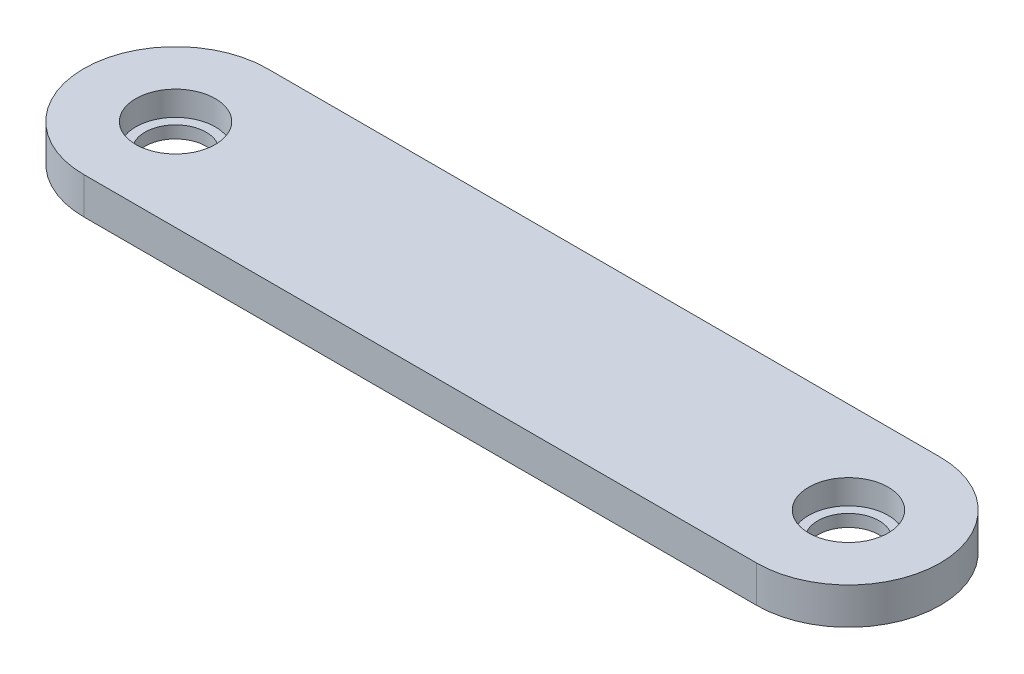
ISO-10303-21;
HEADER;
FILE_DESCRIPTION(('STEP AP214'),'2;1');
FILE_NAME('part.step','',(''),(''),'','','');
FILE_SCHEMA(('AUTOMOTIVE_DESIGN { 1 0 10303 214 1 1 1 1 }'));
ENDSEC;
DATA;
#1=APPLICATION_CONTEXT('core data for automotive mechanical design processes');
#2=APPLICATION_PROTOCOL_DEFINITION('international standard','automotive_design',2000,#1);
#3=PRODUCT_CONTEXT('',#1,'mechanical');
#4=PRODUCT('Part','Part','',(#3));
#5=PRODUCT_RELATED_PRODUCT_CATEGORY('part','',(#4));
#6=PRODUCT_DEFINITION_FORMATION('','',#4);
#7=PRODUCT_DEFINITION_CONTEXT('part definition',#1,'design');
#8=PRODUCT_DEFINITION('design','',#6,#7);
#9=PRODUCT_DEFINITION_SHAPE('','',#8);
#10=(LENGTH_UNIT() NAMED_UNIT(*) SI_UNIT(.MILLI.,.METRE.));
#11=(NAMED_UNIT(*) PLANE_ANGLE_UNIT() SI_UNIT($,.RADIAN.));
#12=(NAMED_UNIT(*) SI_UNIT($,.STERADIAN.) SOLID_ANGLE_UNIT());
#13=UNCERTAINTY_MEASURE_WITH_UNIT(LENGTH_MEASURE(1.E-05),#10,'distance_accuracy_value','');
#14=(GEOMETRIC_REPRESENTATION_CONTEXT(3) GLOBAL_UNCERTAINTY_ASSIGNED_CONTEXT((#13)) GLOBAL_UNIT_ASSIGNED_CONTEXT((#10,
#11,#12)) REPRESENTATION_CONTEXT('',''));
#15=CARTESIAN_POINT('',(0.,0.,0.));
#16=DIRECTION('',(0.,0.,1.));
#17=DIRECTION('',(1.,0.,0.));
#18=AXIS2_PLACEMENT_3D('',#15,#16,#17);
#19=CARTESIAN_POINT('',(-45.,6.,0.));
#20=DIRECTION('',(0.,-1.,0.));
#21=DIRECTION('',(0.,0.,-1.));
#22=AXIS2_PLACEMENT_3D('',#19,#20,#21);
#23=CYLINDRICAL_SURFACE('',#22,5.);
#24=CARTESIAN_POINT('',(-45.,0.,0.));
#25=DIRECTION('',(0.,1.,0.));
#26=DIRECTION('',(0.,0.,1.));
#27=AXIS2_PLACEMENT_3D('',#24,#25,#26);
#28=CIRCLE('',#27,5.);
#29=CARTESIAN_POINT('',(-45.,0.,5.));
#30=VERTEX_POINT('',#29);
#31=EDGE_CURVE('E115',#30,#30,#28,.T.);
#32=ORIENTED_EDGE('',*,*,#31,.F.);
#33=EDGE_LOOP('',(#32));
#34=FACE_BOUND('',#33,.T.);
#35=CARTESIAN_POINT('',(-45.,2.,0.));
#36=DIRECTION('',(0.,1.,0.));
#37=DIRECTION('',(0.,0.,1.));
#38=AXIS2_PLACEMENT_3D('',#35,#36,#37);
#39=CIRCLE('',#38,5.);
#40=CARTESIAN_POINT('',(-45.,2.,5.));
#41=VERTEX_POINT('',#40);
#42=EDGE_CURVE('E43',#41,#41,#39,.T.);
#43=ORIENTED_EDGE('',*,*,#42,.T.);
#44=EDGE_LOOP('',(#43));
#45=FACE_BOUND('',#44,.T.);
#46=ADVANCED_FACE('F39',(#34,#45),#23,.F.);
#47=CARTESIAN_POINT('',(65.,6.,0.));
#48=DIRECTION('',(0.,-1.,0.));
#49=DIRECTION('',(0.,0.,-1.));
#50=AXIS2_PLACEMENT_3D('',#47,#48,#49);
#51=CYLINDRICAL_SURFACE('',#50,5.);
#52=CARTESIAN_POINT('',(65.,0.,0.));
#53=DIRECTION('',(0.,1.,0.));
#54=DIRECTION('',(0.,0.,1.));
#55=AXIS2_PLACEMENT_3D('',#52,#53,#54);
#56=CIRCLE('',#55,5.);
#57=CARTESIAN_POINT('',(65.,0.,5.));
#58=VERTEX_POINT('',#57);
#59=EDGE_CURVE('E134',#58,#58,#56,.T.);
#60=ORIENTED_EDGE('',*,*,#59,.F.);
#61=EDGE_LOOP('',(#60));
#62=FACE_BOUND('',#61,.T.);
#63=CARTESIAN_POINT('',(65.,2.,0.));
#64=DIRECTION('',(0.,1.,0.));
#65=DIRECTION('',(0.,0.,1.));
#66=AXIS2_PLACEMENT_3D('',#63,#64,#65);
#67=CIRCLE('',#66,5.);
#68=CARTESIAN_POINT('',(65.,2.,5.));
#69=VERTEX_POINT('',#68);
#70=EDGE_CURVE('E125',#69,#69,#67,.T.);
#71=ORIENTED_EDGE('',*,*,#70,.T.);
#72=EDGE_LOOP('',(#71));
#73=FACE_BOUND('',#72,.T.);
#74=ADVANCED_FACE('F165',(#62,#73),#51,.F.);
#75=CARTESIAN_POINT('',(65.,6.,0.));
#76=DIRECTION('',(0.,1.,0.));
#77=DIRECTION('',(0.,0.,1.));
#78=AXIS2_PLACEMENT_3D('',#75,#76,#77);
#79=PLANE('',#78);
#80=CARTESIAN_POINT('',(-45.,6.,0.));
#81=DIRECTION('',(0.,1.,0.));
#82=DIRECTION('',(0.,0.,1.));
#83=AXIS2_PLACEMENT_3D('',#80,#81,#82);
#84=CIRCLE('',#83,6.5);
#85=CARTESIAN_POINT('',(-45.,6.,6.5));
#86=VERTEX_POINT('',#85);
#87=EDGE_CURVE('E136',#86,#86,#84,.T.);
#88=ORIENTED_EDGE('',*,*,#87,.F.);
#89=EDGE_LOOP('',(#88));
#90=FACE_BOUND('',#89,.T.);
#91=CARTESIAN_POINT('',(65.,6.,0.));
#92=DIRECTION('',(0.,1.,0.));
#93=DIRECTION('',(0.,0.,1.));
#94=AXIS2_PLACEMENT_3D('',#91,#92,#93);
#95=CIRCLE('',#94,6.5);
#96=CARTESIAN_POINT('',(65.,6.,6.5));
#97=VERTEX_POINT('',#96);
#98=EDGE_CURVE('E148',#97,#97,#95,.T.);
#99=ORIENTED_EDGE('',*,*,#98,.F.);
#100=EDGE_LOOP('',(#99));
#101=FACE_BOUND('',#100,.T.);
#102=CARTESIAN_POINT('',(65.,6.,0.));
#103=DIRECTION('',(0.,1.,0.));
#104=DIRECTION('',(0.,0.,1.));
#105=AXIS2_PLACEMENT_3D('',#102,#103,#104);
#106=CIRCLE('',#105,15.);
#107=CARTESIAN_POINT('',(65.,6.,15.));
#108=VERTEX_POINT('',#107);
#109=CARTESIAN_POINT('',(65.,6.,-15.));
#110=VERTEX_POINT('',#109);
#111=EDGE_CURVE('E94',#108,#110,#106,.T.);
#112=ORIENTED_EDGE('',*,*,#111,.T.);
#113=DIRECTION('',(-1.,0.,0.));
#114=VECTOR('',#113,1.);
#115=CARTESIAN_POINT('',(-45.,6.,-15.));
#116=LINE('',#115,#114);
#117=CARTESIAN_POINT('',(-45.,6.,-15.));
#118=VERTEX_POINT('',#117);
#119=EDGE_CURVE('E89',#110,#118,#116,.T.);
#120=ORIENTED_EDGE('',*,*,#119,.T.);
#121=CARTESIAN_POINT('',(-45.,6.,0.));
#122=DIRECTION('',(0.,1.,0.));
#123=DIRECTION('',(0.,0.,1.));
#124=AXIS2_PLACEMENT_3D('',#121,#122,#123);
#125=CIRCLE('',#124,15.);
#126=CARTESIAN_POINT('',(-45.,6.,15.));
#127=VERTEX_POINT('',#126);
#128=EDGE_CURVE('E92',#118,#127,#125,.T.);
#129=ORIENTED_EDGE('',*,*,#128,.T.);
#130=DIRECTION('',(1.,0.,0.));
#131=VECTOR('',#130,1.);
#132=CARTESIAN_POINT('',(-45.,6.,15.));
#133=LINE('',#132,#131);
#134=EDGE_CURVE('E59',#127,#108,#133,.T.);
#135=ORIENTED_EDGE('',*,*,#134,.T.);
#136=EDGE_LOOP('',(#112,#120,#129,#135));
#137=FACE_BOUND('',#136,.T.);
#138=ADVANCED_FACE('F90',(#90,#101,#137),#79,.T.);
#139=CARTESIAN_POINT('',(65.,0.,0.));
#140=DIRECTION('',(0.,1.,0.));
#141=DIRECTION('',(0.,0.,1.));
#142=AXIS2_PLACEMENT_3D('',#139,#140,#141);
#143=PLANE('',#142);
#144=CARTESIAN_POINT('',(65.,0.,0.));
#145=DIRECTION('',(0.,1.,0.));
#146=DIRECTION('',(0.,0.,1.));
#147=AXIS2_PLACEMENT_3D('',#144,#145,#146);
#148=CIRCLE('',#147,15.);
#149=CARTESIAN_POINT('',(65.,0.,15.));
#150=VERTEX_POINT('',#149);
#151=CARTESIAN_POINT('',(65.,0.,-15.));
#152=VERTEX_POINT('',#151);
#153=EDGE_CURVE('E111',#150,#152,#148,.T.);
#154=ORIENTED_EDGE('',*,*,#153,.F.);
#155=DIRECTION('',(1.,0.,0.));
#156=VECTOR('',#155,1.);
#157=CARTESIAN_POINT('',(-45.,0.,15.));
#158=LINE('',#157,#156);
#159=CARTESIAN_POINT('',(-45.,0.,15.));
#160=VERTEX_POINT('',#159);
#161=EDGE_CURVE('E82',#160,#150,#158,.T.);
#162=ORIENTED_EDGE('',*,*,#161,.F.);
#163=CARTESIAN_POINT('',(-45.,0.,0.));
#164=DIRECTION('',(0.,1.,0.));
#165=DIRECTION('',(0.,0.,1.));
#166=AXIS2_PLACEMENT_3D('',#163,#164,#165);
#167=CIRCLE('',#166,15.);
#168=CARTESIAN_POINT('',(-45.,0.,-15.));
#169=VERTEX_POINT('',#168);
#170=EDGE_CURVE('E76',#169,#160,#167,.T.);
#171=ORIENTED_EDGE('',*,*,#170,.F.);
#172=DIRECTION('',(-1.,0.,0.));
#173=VECTOR('',#172,1.);
#174=CARTESIAN_POINT('',(-45.,0.,-15.));
#175=LINE('',#174,#173);
#176=EDGE_CURVE('E99',#152,#169,#175,.T.);
#177=ORIENTED_EDGE('',*,*,#176,.F.);
#178=EDGE_LOOP('',(#154,#162,#171,#177));
#179=FACE_BOUND('',#178,.T.);
#180=ORIENTED_EDGE('',*,*,#31,.T.);
#181=EDGE_LOOP('',(#180));
#182=FACE_BOUND('',#181,.T.);
#183=ORIENTED_EDGE('',*,*,#59,.T.);
#184=EDGE_LOOP('',(#183));
#185=FACE_BOUND('',#184,.T.);
#186=ADVANCED_FACE('F160',(#179,#182,#185),#143,.F.);
#187=CARTESIAN_POINT('',(65.,6.,0.));
#188=DIRECTION('',(0.,-1.,0.));
#189=DIRECTION('',(0.,0.,-1.));
#190=AXIS2_PLACEMENT_3D('',#187,#188,#189);
#191=CYLINDRICAL_SURFACE('',#190,15.);
#192=ORIENTED_EDGE('',*,*,#153,.T.);
#193=DIRECTION('',(0.,-1.,0.));
#194=VECTOR('',#193,1.);
#195=CARTESIAN_POINT('',(65.,6.,-15.));
#196=LINE('',#195,#194);
#197=EDGE_CURVE('E11',#110,#152,#196,.T.);
#198=ORIENTED_EDGE('',*,*,#197,.F.);
#199=ORIENTED_EDGE('',*,*,#111,.F.);
#200=DIRECTION('',(0.,-1.,0.));
#201=VECTOR('',#200,1.);
#202=CARTESIAN_POINT('',(65.,6.,15.));
#203=LINE('',#202,#201);
#204=EDGE_CURVE('E107',#108,#150,#203,.T.);
#205=ORIENTED_EDGE('',*,*,#204,.T.);
#206=EDGE_LOOP('',(#192,#198,#199,#205));
#207=FACE_BOUND('',#206,.T.);
#208=ADVANCED_FACE('F41',(#207),#191,.T.);
#209=CARTESIAN_POINT('',(-45.,6.,-15.));
#210=DIRECTION('',(0.,0.,1.));
#211=DIRECTION('',(1.,0.,0.));
#212=AXIS2_PLACEMENT_3D('',#209,#210,#211);
#213=PLANE('',#212);
#214=ORIENTED_EDGE('',*,*,#176,.T.);
#215=DIRECTION('',(0.,-1.,0.));
#216=VECTOR('',#215,1.);
#217=CARTESIAN_POINT('',(-45.,6.,-15.));
#218=LINE('',#217,#216);
#219=EDGE_CURVE('E50',#118,#169,#218,.T.);
#220=ORIENTED_EDGE('',*,*,#219,.F.);
#221=ORIENTED_EDGE('',*,*,#119,.F.);
#222=ORIENTED_EDGE('',*,*,#197,.T.);
#223=EDGE_LOOP('',(#214,#220,#221,#222));
#224=FACE_BOUND('',#223,.T.);
#225=ADVANCED_FACE('F98',(#224),#213,.F.);
#226=CARTESIAN_POINT('',(-45.,6.,0.));
#227=DIRECTION('',(0.,-1.,0.));
#228=DIRECTION('',(0.,0.,-1.));
#229=AXIS2_PLACEMENT_3D('',#226,#227,#228);
#230=CYLINDRICAL_SURFACE('',#229,15.);
#231=ORIENTED_EDGE('',*,*,#170,.T.);
#232=DIRECTION('',(0.,-1.,0.));
#233=VECTOR('',#232,1.);
#234=CARTESIAN_POINT('',(-45.,6.,15.));
#235=LINE('',#234,#233);
#236=EDGE_CURVE('E101',#127,#160,#235,.T.);
#237=ORIENTED_EDGE('',*,*,#236,.F.);
#238=ORIENTED_EDGE('',*,*,#128,.F.);
#239=ORIENTED_EDGE('',*,*,#219,.T.);
#240=EDGE_LOOP('',(#231,#237,#238,#239));
#241=FACE_BOUND('',#240,.T.);
#242=ADVANCED_FACE('F103',(#241),#230,.T.);
#243=CARTESIAN_POINT('',(-45.,6.,15.));
#244=DIRECTION('',(0.,0.,-1.));
#245=DIRECTION('',(-1.,0.,0.));
#246=AXIS2_PLACEMENT_3D('',#243,#244,#245);
#247=PLANE('',#246);
#248=ORIENTED_EDGE('',*,*,#161,.T.);
#249=ORIENTED_EDGE('',*,*,#204,.F.);
#250=ORIENTED_EDGE('',*,*,#134,.F.);
#251=ORIENTED_EDGE('',*,*,#236,.T.);
#252=EDGE_LOOP('',(#248,#249,#250,#251));
#253=FACE_BOUND('',#252,.T.);
#254=ADVANCED_FACE('F186',(#253),#247,.F.);
#255=CARTESIAN_POINT('',(65.,2.,0.));
#256=DIRECTION('',(0.,1.,0.));
#257=DIRECTION('',(0.,0.,1.));
#258=AXIS2_PLACEMENT_3D('',#255,#256,#257);
#259=CYLINDRICAL_SURFACE('',#258,6.5);
#260=CARTESIAN_POINT('',(65.,2.,0.));
#261=DIRECTION('',(0.,1.,0.));
#262=DIRECTION('',(0.,0.,1.));
#263=AXIS2_PLACEMENT_3D('',#260,#261,#262);
#264=CIRCLE('',#263,6.5);
#265=CARTESIAN_POINT('',(65.,2.,6.5));
#266=VERTEX_POINT('',#265);
#267=EDGE_CURVE('E142',#266,#266,#264,.T.);
#268=ORIENTED_EDGE('',*,*,#267,.F.);
#269=EDGE_LOOP('',(#268));
#270=FACE_BOUND('',#269,.T.);
#271=ORIENTED_EDGE('',*,*,#98,.T.);
#272=EDGE_LOOP('',(#271));
#273=FACE_BOUND('',#272,.T.);
#274=ADVANCED_FACE('F182',(#270,#273),#259,.F.);
#275=CARTESIAN_POINT('',(65.,2.,0.));
#276=DIRECTION('',(0.,1.,0.));
#277=DIRECTION('',(0.,0.,1.));
#278=AXIS2_PLACEMENT_3D('',#275,#276,#277);
#279=PLANE('',#278);
#280=ORIENTED_EDGE('',*,*,#70,.F.);
#281=EDGE_LOOP('',(#280));
#282=FACE_BOUND('',#281,.T.);
#283=ORIENTED_EDGE('',*,*,#267,.T.);
#284=EDGE_LOOP('',(#283));
#285=FACE_BOUND('',#284,.T.);
#286=ADVANCED_FACE('F176',(#282,#285),#279,.T.);
#287=CARTESIAN_POINT('',(-45.,2.,0.));
#288=DIRECTION('',(0.,1.,0.));
#289=DIRECTION('',(0.,0.,1.));
#290=AXIS2_PLACEMENT_3D('',#287,#288,#289);
#291=CYLINDRICAL_SURFACE('',#290,6.5);
#292=CARTESIAN_POINT('',(-45.,2.,0.));
#293=DIRECTION('',(0.,1.,0.));
#294=DIRECTION('',(0.,0.,1.));
#295=AXIS2_PLACEMENT_3D('',#292,#293,#294);
#296=CIRCLE('',#295,6.5);
#297=CARTESIAN_POINT('',(-45.,2.,6.5));
#298=VERTEX_POINT('',#297);
#299=EDGE_CURVE('E128',#298,#298,#296,.T.);
#300=ORIENTED_EDGE('',*,*,#299,.F.);
#301=EDGE_LOOP('',(#300));
#302=FACE_BOUND('',#301,.T.);
#303=ORIENTED_EDGE('',*,*,#87,.T.);
#304=EDGE_LOOP('',(#303));
#305=FACE_BOUND('',#304,.T.);
#306=ADVANCED_FACE('F171',(#302,#305),#291,.F.);
#307=CARTESIAN_POINT('',(-45.,2.,0.));
#308=DIRECTION('',(0.,1.,0.));
#309=DIRECTION('',(0.,0.,1.));
#310=AXIS2_PLACEMENT_3D('',#307,#308,#309);
#311=PLANE('',#310);
#312=ORIENTED_EDGE('',*,*,#42,.F.);
#313=EDGE_LOOP('',(#312));
#314=FACE_BOUND('',#313,.T.);
#315=ORIENTED_EDGE('',*,*,#299,.T.);
#316=EDGE_LOOP('',(#315));
#317=FACE_BOUND('',#316,.T.);
#318=ADVANCED_FACE('F169',(#314,#317),#311,.T.);
#319=CLOSED_SHELL('',(#46,#74,#138,#186,#208,#225,#242,#254,#274,#286,#306,#318));
#320=MANIFOLD_SOLID_BREP('B2',#319);
#321=ADVANCED_BREP_SHAPE_REPRESENTATION('',(#18,#320),#14);
#322=SHAPE_DEFINITION_REPRESENTATION(#9,#321);
ENDSEC;
END-ISO-10303-21;
